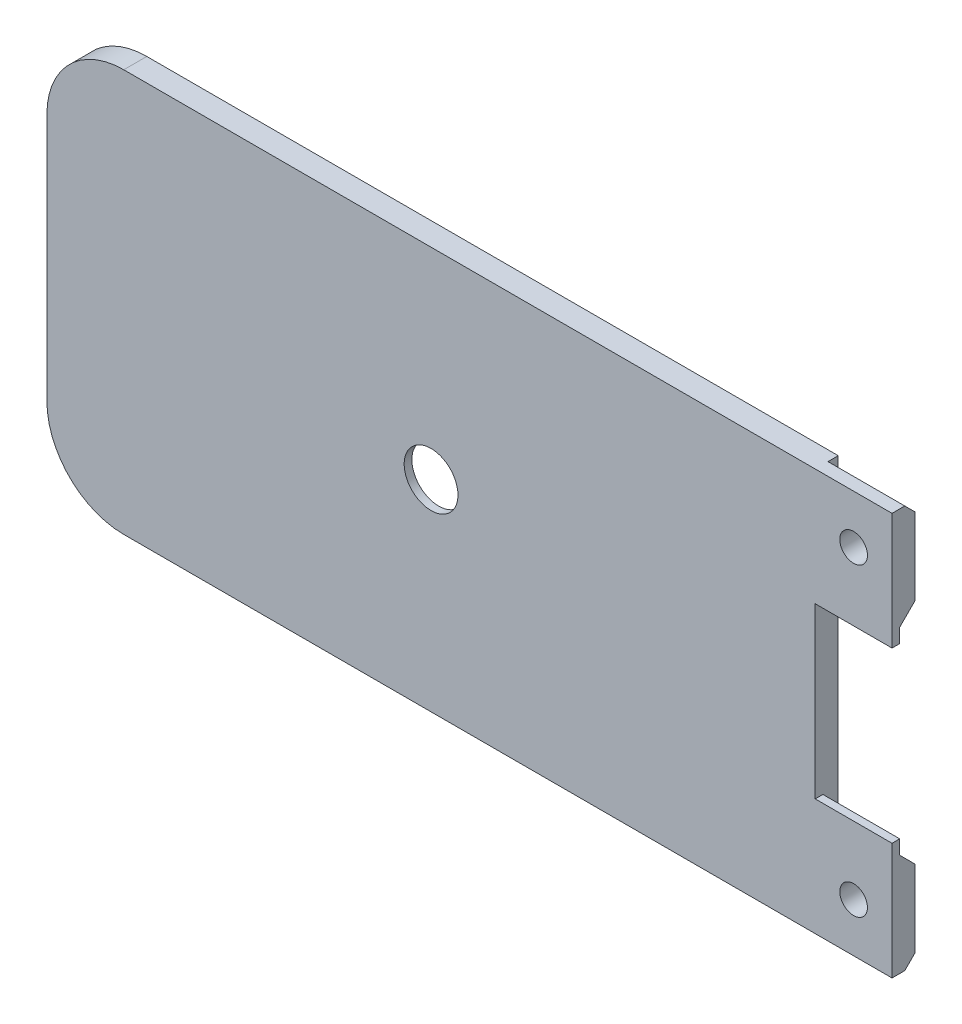
ISO-10303-21;
HEADER;
FILE_DESCRIPTION(('STEP AP214'),'2;1');
FILE_NAME('part.step','',(''),(''),'','','');
FILE_SCHEMA(('AUTOMOTIVE_DESIGN { 1 0 10303 214 1 1 1 1 }'));
ENDSEC;
DATA;
#1=APPLICATION_CONTEXT('core data for automotive mechanical design processes');
#2=APPLICATION_PROTOCOL_DEFINITION('international standard','automotive_design',2000,#1);
#3=PRODUCT_CONTEXT('',#1,'mechanical');
#4=PRODUCT('Part','Part','',(#3));
#5=PRODUCT_RELATED_PRODUCT_CATEGORY('part','',(#4));
#6=PRODUCT_DEFINITION_FORMATION('','',#4);
#7=PRODUCT_DEFINITION_CONTEXT('part definition',#1,'design');
#8=PRODUCT_DEFINITION('design','',#6,#7);
#9=PRODUCT_DEFINITION_SHAPE('','',#8);
#10=(LENGTH_UNIT() NAMED_UNIT(*) SI_UNIT(.MILLI.,.METRE.));
#11=(NAMED_UNIT(*) PLANE_ANGLE_UNIT() SI_UNIT($,.RADIAN.));
#12=(NAMED_UNIT(*) SI_UNIT($,.STERADIAN.) SOLID_ANGLE_UNIT());
#13=UNCERTAINTY_MEASURE_WITH_UNIT(LENGTH_MEASURE(1.E-05),#10,'distance_accuracy_value','');
#14=(GEOMETRIC_REPRESENTATION_CONTEXT(3) GLOBAL_UNCERTAINTY_ASSIGNED_CONTEXT((#13)) GLOBAL_UNIT_ASSIGNED_CONTEXT((#10,
#11,#12)) REPRESENTATION_CONTEXT('',''));
#15=CARTESIAN_POINT('',(0.,0.,0.));
#16=DIRECTION('',(0.,0.,1.));
#17=DIRECTION('',(1.,0.,0.));
#18=AXIS2_PLACEMENT_3D('',#15,#16,#17);
#19=CARTESIAN_POINT('',(0.,0.,0.));
#20=DIRECTION('',(0.,0.,1.));
#21=DIRECTION('',(1.,0.,0.));
#22=AXIS2_PLACEMENT_3D('',#19,#20,#21);
#23=CYLINDRICAL_SURFACE('',#22,3.5);
#24=CARTESIAN_POINT('',(0.,0.,3.));
#25=DIRECTION('',(0.,0.,1.));
#26=DIRECTION('',(1.,0.,0.));
#27=AXIS2_PLACEMENT_3D('',#24,#25,#26);
#28=CIRCLE('',#27,3.5);
#29=CARTESIAN_POINT('',(3.5,0.,3.));
#30=VERTEX_POINT('',#29);
#31=EDGE_CURVE('E349',#30,#30,#28,.T.);
#32=ORIENTED_EDGE('',*,*,#31,.T.);
#33=EDGE_LOOP('',(#32));
#34=FACE_BOUND('',#33,.T.);
#35=CARTESIAN_POINT('',(0.,0.,2.));
#36=DIRECTION('',(0.,0.,-1.));
#37=DIRECTION('',(-1.,0.,0.));
#38=AXIS2_PLACEMENT_3D('',#35,#36,#37);
#39=CIRCLE('',#38,3.5);
#40=CARTESIAN_POINT('',(-3.5,0.,2.));
#41=VERTEX_POINT('',#40);
#42=EDGE_CURVE('E347',#41,#41,#39,.F.);
#43=ORIENTED_EDGE('',*,*,#42,.F.);
#44=EDGE_LOOP('',(#43));
#45=FACE_BOUND('',#44,.T.);
#46=ADVANCED_FACE('F87',(#34,#45),#23,.F.);
#47=CARTESIAN_POINT('',(50.,26.19,3.));
#48=DIRECTION('',(0.,-1.,0.));
#49=DIRECTION('',(1.,0.,0.));
#50=AXIS2_PLACEMENT_3D('',#47,#48,#49);
#51=PLANE('',#50);
#52=DIRECTION('',(-1.,0.,0.));
#53=VECTOR('',#52,1.);
#54=CARTESIAN_POINT('',(50.,26.19,0.));
#55=LINE('',#54,#53);
#56=CARTESIAN_POINT('',(50.,26.19,0.));
#57=VERTEX_POINT('',#56);
#58=CARTESIAN_POINT('',(-40.,26.19,0.));
#59=VERTEX_POINT('',#58);
#60=EDGE_CURVE('E308',#57,#59,#55,.T.);
#61=ORIENTED_EDGE('',*,*,#60,.T.);
#62=DIRECTION('',(0.,0.,-1.));
#63=VECTOR('',#62,1.);
#64=CARTESIAN_POINT('',(-40.,26.19,3.));
#65=LINE('',#64,#63);
#66=CARTESIAN_POINT('',(-40.,26.19,3.));
#67=VERTEX_POINT('',#66);
#68=EDGE_CURVE('E12',#59,#67,#65,.F.);
#69=ORIENTED_EDGE('',*,*,#68,.T.);
#70=DIRECTION('',(-1.,0.,0.));
#71=VECTOR('',#70,1.);
#72=CARTESIAN_POINT('',(50.,26.19,3.));
#73=LINE('',#72,#71);
#74=CARTESIAN_POINT('',(60.0000000000001,26.19,3.));
#75=VERTEX_POINT('',#74);
#76=EDGE_CURVE('E294',#75,#67,#73,.T.);
#77=ORIENTED_EDGE('',*,*,#76,.F.);
#78=DIRECTION('',(0.,0.,-1.));
#79=VECTOR('',#78,1.);
#80=CARTESIAN_POINT('',(60.0000000000001,26.19,3.));
#81=LINE('',#80,#79);
#82=CARTESIAN_POINT('',(60.0000000000001,26.19,1.34000000000001));
#83=VERTEX_POINT('',#82);
#84=EDGE_CURVE('E321',#75,#83,#81,.T.);
#85=ORIENTED_EDGE('',*,*,#84,.T.);
#86=DIRECTION('',(1.,0.,0.));
#87=VECTOR('',#86,1.);
#88=CARTESIAN_POINT('',(45.661509479093,26.19,1.34000000000001));
#89=LINE('',#88,#87);
#90=CARTESIAN_POINT('',(50.,26.19,1.34000000000001));
#91=VERTEX_POINT('',#90);
#92=EDGE_CURVE('E267',#91,#83,#89,.T.);
#93=ORIENTED_EDGE('',*,*,#92,.F.);
#94=DIRECTION('',(0.,0.,1.));
#95=VECTOR('',#94,1.);
#96=CARTESIAN_POINT('',(50.,26.19,1.34000000000001));
#97=LINE('',#96,#95);
#98=EDGE_CURVE('E271',#57,#91,#97,.T.);
#99=ORIENTED_EDGE('',*,*,#98,.F.);
#100=EDGE_LOOP('',(#61,#69,#77,#85,#93,#99));
#101=FACE_BOUND('',#100,.T.);
#102=ADVANCED_FACE('F379',(#101),#51,.F.);
#103=CARTESIAN_POINT('',(0.,0.,0.));
#104=DIRECTION('',(0.,0.,-1.));
#105=DIRECTION('',(-1.,0.,0.));
#106=AXIS2_PLACEMENT_3D('',#103,#104,#105);
#107=PLANE('',#106);
#108=CARTESIAN_POINT('',(0.,0.,0.));
#109=DIRECTION('',(0.,0.,-1.));
#110=DIRECTION('',(-1.,0.,0.));
#111=AXIS2_PLACEMENT_3D('',#108,#109,#110);
#112=CIRCLE('',#111,6.5);
#113=CARTESIAN_POINT('',(-6.5,0.,0.));
#114=VERTEX_POINT('',#113);
#115=EDGE_CURVE('E650',#114,#114,#112,.T.);
#116=ORIENTED_EDGE('',*,*,#115,.F.);
#117=EDGE_LOOP('',(#116));
#118=FACE_BOUND('',#117,.T.);
#119=CARTESIAN_POINT('',(55.,19.85,0.));
#120=DIRECTION('',(0.,0.,-1.));
#121=DIRECTION('',(-1.,0.,0.));
#122=AXIS2_PLACEMENT_3D('',#119,#120,#121);
#123=CIRCLE('',#122,1.8);
#124=CARTESIAN_POINT('',(53.2,19.85,0.));
#125=VERTEX_POINT('',#124);
#126=EDGE_CURVE('E651',#125,#125,#123,.T.);
#127=ORIENTED_EDGE('',*,*,#126,.F.);
#128=EDGE_LOOP('',(#127));
#129=FACE_BOUND('',#128,.T.);
#130=CARTESIAN_POINT('',(55.,-19.85,0.));
#131=DIRECTION('',(0.,0.,-1.));
#132=DIRECTION('',(1.,0.,0.));
#133=AXIS2_PLACEMENT_3D('',#130,#131,#132);
#134=CIRCLE('',#133,1.8);
#135=CARTESIAN_POINT('',(56.8000000000001,-19.85,0.));
#136=VERTEX_POINT('',#135);
#137=EDGE_CURVE('E652',#136,#136,#134,.T.);
#138=ORIENTED_EDGE('',*,*,#137,.F.);
#139=EDGE_LOOP('',(#138));
#140=FACE_BOUND('',#139,.T.);
#141=DIRECTION('',(-1.,0.,0.));
#142=VECTOR('',#141,1.);
#143=CARTESIAN_POINT('',(50.,-26.19,0.));
#144=LINE('',#143,#142);
#145=CARTESIAN_POINT('',(50.,-26.19,0.));
#146=VERTEX_POINT('',#145);
#147=CARTESIAN_POINT('',(-40.,-26.19,0.));
#148=VERTEX_POINT('',#147);
#149=EDGE_CURVE('E315',#146,#148,#144,.T.);
#150=ORIENTED_EDGE('',*,*,#149,.T.);
#151=CARTESIAN_POINT('',(-40.,-16.19,0.));
#152=DIRECTION('',(0.,0.,-1.));
#153=DIRECTION('',(-1.,0.,0.));
#154=AXIS2_PLACEMENT_3D('',#151,#152,#153);
#155=CIRCLE('',#154,10.);
#156=CARTESIAN_POINT('',(-50.,-16.19,0.));
#157=VERTEX_POINT('',#156);
#158=EDGE_CURVE('E354',#148,#157,#155,.T.);
#159=ORIENTED_EDGE('',*,*,#158,.T.);
#160=DIRECTION('',(0.,1.,0.));
#161=VECTOR('',#160,1.);
#162=CARTESIAN_POINT('',(-50.,-26.19,0.));
#163=LINE('',#162,#161);
#164=CARTESIAN_POINT('',(-50.,16.19,0.));
#165=VERTEX_POINT('',#164);
#166=EDGE_CURVE('E306',#157,#165,#163,.T.);
#167=ORIENTED_EDGE('',*,*,#166,.T.);
#168=CARTESIAN_POINT('',(-40.,16.19,0.));
#169=DIRECTION('',(0.,0.,-1.));
#170=DIRECTION('',(-1.,0.,0.));
#171=AXIS2_PLACEMENT_3D('',#168,#169,#170);
#172=CIRCLE('',#171,10.);
#173=EDGE_CURVE('E352',#165,#59,#172,.T.);
#174=ORIENTED_EDGE('',*,*,#173,.T.);
#175=ORIENTED_EDGE('',*,*,#60,.F.);
#176=DIRECTION('',(0.,1.,0.));
#177=VECTOR('',#176,1.);
#178=CARTESIAN_POINT('',(50.,26.19,0.));
#179=LINE('',#178,#177);
#180=CARTESIAN_POINT('',(50.,24.85,0.));
#181=VERTEX_POINT('',#180);
#182=EDGE_CURVE('E273',#181,#57,#179,.T.);
#183=ORIENTED_EDGE('',*,*,#182,.F.);
#184=DIRECTION('',(1.,0.,0.));
#185=VECTOR('',#184,1.);
#186=CARTESIAN_POINT('',(45.661509479093,24.85,0.));
#187=LINE('',#186,#185);
#188=CARTESIAN_POINT('',(60.0000000000001,24.85,0.));
#189=VERTEX_POINT('',#188);
#190=EDGE_CURVE('E262',#181,#189,#187,.T.);
#191=ORIENTED_EDGE('',*,*,#190,.T.);
#192=DIRECTION('',(0.,-1.,0.));
#193=VECTOR('',#192,1.);
#194=CARTESIAN_POINT('',(60.0000000000001,26.19,0.));
#195=LINE('',#194,#193);
#196=CARTESIAN_POINT('',(60.0000000000001,14.85,0.));
#197=VERTEX_POINT('',#196);
#198=EDGE_CURVE('E318',#189,#197,#195,.T.);
#199=ORIENTED_EDGE('',*,*,#198,.T.);
#200=DIRECTION('',(1.,0.,0.));
#201=VECTOR('',#200,1.);
#202=CARTESIAN_POINT('',(45.661509479093,14.85,0.));
#203=LINE('',#202,#201);
#204=CARTESIAN_POINT('',(50.,14.85,0.));
#205=VERTEX_POINT('',#204);
#206=EDGE_CURVE('E260',#205,#197,#203,.T.);
#207=ORIENTED_EDGE('',*,*,#206,.F.);
#208=DIRECTION('',(0.,1.,0.));
#209=VECTOR('',#208,1.);
#210=CARTESIAN_POINT('',(50.,-26.19,0.));
#211=LINE('',#210,#209);
#212=CARTESIAN_POINT('',(50.,-14.85,0.));
#213=VERTEX_POINT('',#212);
#214=EDGE_CURVE('E300',#213,#205,#211,.T.);
#215=ORIENTED_EDGE('',*,*,#214,.F.);
#216=DIRECTION('',(1.,0.,0.));
#217=VECTOR('',#216,1.);
#218=CARTESIAN_POINT('',(45.661509479093,-14.85,0.));
#219=LINE('',#218,#217);
#220=CARTESIAN_POINT('',(60.0000000000001,-14.85,0.));
#221=VERTEX_POINT('',#220);
#222=EDGE_CURVE('E286',#213,#221,#219,.T.);
#223=ORIENTED_EDGE('',*,*,#222,.T.);
#224=DIRECTION('',(0.,1.,0.));
#225=VECTOR('',#224,1.);
#226=CARTESIAN_POINT('',(60.0000000000001,-26.19,0.));
#227=LINE('',#226,#225);
#228=CARTESIAN_POINT('',(60.0000000000001,-24.85,0.));
#229=VERTEX_POINT('',#228);
#230=EDGE_CURVE('E233',#229,#221,#227,.T.);
#231=ORIENTED_EDGE('',*,*,#230,.F.);
#232=DIRECTION('',(1.,0.,0.));
#233=VECTOR('',#232,1.);
#234=CARTESIAN_POINT('',(45.661509479093,-24.85,0.));
#235=LINE('',#234,#233);
#236=CARTESIAN_POINT('',(50.,-24.85,0.));
#237=VERTEX_POINT('',#236);
#238=EDGE_CURVE('E214',#237,#229,#235,.T.);
#239=ORIENTED_EDGE('',*,*,#238,.F.);
#240=DIRECTION('',(0.,1.,0.));
#241=VECTOR('',#240,1.);
#242=CARTESIAN_POINT('',(50.,-26.19,0.));
#243=LINE('',#242,#241);
#244=EDGE_CURVE('E221',#146,#237,#243,.T.);
#245=ORIENTED_EDGE('',*,*,#244,.F.);
#246=EDGE_LOOP('',(#150,#159,#167,#174,#175,#183,#191,#199,#207,#215,#223,#231,#239,#245));
#247=FACE_BOUND('',#246,.T.);
#248=ADVANCED_FACE('F235',(#118,#129,#140,#247),#107,.T.);
#249=CARTESIAN_POINT('',(50.,-26.19,3.));
#250=DIRECTION('',(0.,-1.,0.));
#251=DIRECTION('',(1.,0.,0.));
#252=AXIS2_PLACEMENT_3D('',#249,#250,#251);
#253=PLANE('',#252);
#254=DIRECTION('',(-1.,0.,0.));
#255=VECTOR('',#254,1.);
#256=CARTESIAN_POINT('',(50.,-26.19,3.));
#257=LINE('',#256,#255);
#258=CARTESIAN_POINT('',(60.0000000000001,-26.19,3.));
#259=VERTEX_POINT('',#258);
#260=CARTESIAN_POINT('',(-40.,-26.19,3.));
#261=VERTEX_POINT('',#260);
#262=EDGE_CURVE('E298',#259,#261,#257,.T.);
#263=ORIENTED_EDGE('',*,*,#262,.T.);
#264=DIRECTION('',(0.,0.,-1.));
#265=VECTOR('',#264,1.);
#266=CARTESIAN_POINT('',(-40.,-26.19,3.));
#267=LINE('',#266,#265);
#268=EDGE_CURVE('E327',#261,#148,#267,.T.);
#269=ORIENTED_EDGE('',*,*,#268,.T.);
#270=ORIENTED_EDGE('',*,*,#149,.F.);
#271=DIRECTION('',(0.,0.,-1.));
#272=VECTOR('',#271,1.);
#273=CARTESIAN_POINT('',(50.,-26.19,1.34000000000001));
#274=LINE('',#273,#272);
#275=CARTESIAN_POINT('',(50.,-26.19,1.34000000000001));
#276=VERTEX_POINT('',#275);
#277=EDGE_CURVE('E226',#276,#146,#274,.T.);
#278=ORIENTED_EDGE('',*,*,#277,.F.);
#279=DIRECTION('',(1.,0.,0.));
#280=VECTOR('',#279,1.);
#281=CARTESIAN_POINT('',(45.661509479093,-26.19,1.34000000000001));
#282=LINE('',#281,#280);
#283=CARTESIAN_POINT('',(60.0000000000001,-26.19,1.34000000000001));
#284=VERTEX_POINT('',#283);
#285=EDGE_CURVE('E217',#276,#284,#282,.T.);
#286=ORIENTED_EDGE('',*,*,#285,.T.);
#287=DIRECTION('',(0.,0.,-1.));
#288=VECTOR('',#287,1.);
#289=CARTESIAN_POINT('',(60.0000000000001,-26.19,3.));
#290=LINE('',#289,#288);
#291=EDGE_CURVE('E322',#259,#284,#290,.T.);
#292=ORIENTED_EDGE('',*,*,#291,.F.);
#293=EDGE_LOOP('',(#263,#269,#270,#278,#286,#292));
#294=FACE_BOUND('',#293,.T.);
#295=ADVANCED_FACE('F367',(#294),#253,.T.);
#296=CARTESIAN_POINT('',(60.0000000000001,-26.19,3.));
#297=DIRECTION('',(-1.,0.,0.));
#298=DIRECTION('',(0.,0.,1.));
#299=AXIS2_PLACEMENT_3D('',#296,#297,#298);
#300=PLANE('',#299);
#301=DIRECTION('',(0.,-0.707106781186548,0.707106781186547));
#302=VECTOR('',#301,1.);
#303=CARTESIAN_POINT('',(60.0000000000001,-24.85,0.));
#304=LINE('',#303,#302);
#305=EDGE_CURVE('E222',#229,#284,#304,.T.);
#306=ORIENTED_EDGE('',*,*,#305,.F.);
#307=ORIENTED_EDGE('',*,*,#230,.T.);
#308=DIRECTION('',(0.,-0.707106781186547,-0.707106781186548));
#309=VECTOR('',#308,1.);
#310=CARTESIAN_POINT('',(60.0000000000001,-12.85,2.));
#311=LINE('',#310,#309);
#312=CARTESIAN_POINT('',(60.0000000000001,-12.85,2.));
#313=VERTEX_POINT('',#312);
#314=EDGE_CURVE('E279',#313,#221,#311,.T.);
#315=ORIENTED_EDGE('',*,*,#314,.F.);
#316=DIRECTION('',(0.,-1.,0.));
#317=VECTOR('',#316,1.);
#318=CARTESIAN_POINT('',(60.0000000000001,-11.,2.));
#319=LINE('',#318,#317);
#320=CARTESIAN_POINT('',(60.0000000000001,-11.,2.));
#321=VERTEX_POINT('',#320);
#322=EDGE_CURVE('E249',#321,#313,#319,.T.);
#323=ORIENTED_EDGE('',*,*,#322,.F.);
#324=DIRECTION('',(0.,0.,-1.));
#325=VECTOR('',#324,1.);
#326=CARTESIAN_POINT('',(60.0000000000001,-11.,3.));
#327=LINE('',#326,#325);
#328=CARTESIAN_POINT('',(60.0000000000001,-11.,3.));
#329=VERTEX_POINT('',#328);
#330=EDGE_CURVE('E337',#329,#321,#327,.T.);
#331=ORIENTED_EDGE('',*,*,#330,.F.);
#332=DIRECTION('',(0.,1.,0.));
#333=VECTOR('',#332,1.);
#334=CARTESIAN_POINT('',(60.0000000000001,-26.19,3.));
#335=LINE('',#334,#333);
#336=EDGE_CURVE('E334',#259,#329,#335,.T.);
#337=ORIENTED_EDGE('',*,*,#336,.F.);
#338=ORIENTED_EDGE('',*,*,#291,.T.);
#339=EDGE_LOOP('',(#306,#307,#315,#323,#331,#337,#338));
#340=FACE_BOUND('',#339,.T.);
#341=ADVANCED_FACE('F413',(#340),#300,.F.);
#342=CARTESIAN_POINT('',(-50.,-26.19,3.));
#343=DIRECTION('',(-1.,0.,0.));
#344=DIRECTION('',(0.,0.,1.));
#345=AXIS2_PLACEMENT_3D('',#342,#343,#344);
#346=PLANE('',#345);
#347=ORIENTED_EDGE('',*,*,#166,.F.);
#348=DIRECTION('',(0.,0.,-1.));
#349=VECTOR('',#348,1.);
#350=CARTESIAN_POINT('',(-50.,-16.19,3.));
#351=LINE('',#350,#349);
#352=CARTESIAN_POINT('',(-50.,-16.19,3.));
#353=VERTEX_POINT('',#352);
#354=EDGE_CURVE('E358',#157,#353,#351,.F.);
#355=ORIENTED_EDGE('',*,*,#354,.T.);
#356=DIRECTION('',(0.,1.,0.));
#357=VECTOR('',#356,1.);
#358=CARTESIAN_POINT('',(-50.,-26.19,3.));
#359=LINE('',#358,#357);
#360=CARTESIAN_POINT('',(-50.,16.19,3.));
#361=VERTEX_POINT('',#360);
#362=EDGE_CURVE('E296',#353,#361,#359,.T.);
#363=ORIENTED_EDGE('',*,*,#362,.T.);
#364=DIRECTION('',(0.,0.,-1.));
#365=VECTOR('',#364,1.);
#366=CARTESIAN_POINT('',(-50.,16.19,0.));
#367=LINE('',#366,#365);
#368=EDGE_CURVE('E360',#361,#165,#367,.T.);
#369=ORIENTED_EDGE('',*,*,#368,.T.);
#370=EDGE_LOOP('',(#347,#355,#363,#369));
#371=FACE_BOUND('',#370,.T.);
#372=ADVANCED_FACE('F372',(#371),#346,.T.);
#373=CARTESIAN_POINT('',(0.,0.,3.));
#374=DIRECTION('',(0.,0.,-1.));
#375=DIRECTION('',(-1.,0.,0.));
#376=AXIS2_PLACEMENT_3D('',#373,#374,#375);
#377=PLANE('',#376);
#378=ORIENTED_EDGE('',*,*,#31,.F.);
#379=EDGE_LOOP('',(#378));
#380=FACE_BOUND('',#379,.T.);
#381=CARTESIAN_POINT('',(55.,19.85,3.));
#382=DIRECTION('',(0.,0.,-1.));
#383=DIRECTION('',(-1.,0.,0.));
#384=AXIS2_PLACEMENT_3D('',#381,#382,#383);
#385=CIRCLE('',#384,1.8);
#386=CARTESIAN_POINT('',(53.2,19.85,3.));
#387=VERTEX_POINT('',#386);
#388=EDGE_CURVE('E268',#387,#387,#385,.T.);
#389=ORIENTED_EDGE('',*,*,#388,.T.);
#390=EDGE_LOOP('',(#389));
#391=FACE_BOUND('',#390,.T.);
#392=CARTESIAN_POINT('',(55.,-19.85,3.));
#393=DIRECTION('',(0.,0.,-1.));
#394=DIRECTION('',(1.,0.,0.));
#395=AXIS2_PLACEMENT_3D('',#392,#393,#394);
#396=CIRCLE('',#395,1.8);
#397=CARTESIAN_POINT('',(56.8000000000001,-19.85,3.));
#398=VERTEX_POINT('',#397);
#399=EDGE_CURVE('E242',#398,#398,#396,.T.);
#400=ORIENTED_EDGE('',*,*,#399,.T.);
#401=EDGE_LOOP('',(#400));
#402=FACE_BOUND('',#401,.T.);
#403=ORIENTED_EDGE('',*,*,#362,.F.);
#404=CARTESIAN_POINT('',(-40.,-16.19,3.));
#405=DIRECTION('',(0.,0.,-1.));
#406=DIRECTION('',(-1.,0.,0.));
#407=AXIS2_PLACEMENT_3D('',#404,#405,#406);
#408=CIRCLE('',#407,10.);
#409=EDGE_CURVE('E92',#353,#261,#408,.F.);
#410=ORIENTED_EDGE('',*,*,#409,.T.);
#411=ORIENTED_EDGE('',*,*,#262,.F.);
#412=ORIENTED_EDGE('',*,*,#336,.T.);
#413=DIRECTION('',(1.,0.,0.));
#414=VECTOR('',#413,1.);
#415=CARTESIAN_POINT('',(50.,-11.,3.));
#416=LINE('',#415,#414);
#417=CARTESIAN_POINT('',(50.,-11.,3.));
#418=VERTEX_POINT('',#417);
#419=EDGE_CURVE('E333',#418,#329,#416,.T.);
#420=ORIENTED_EDGE('',*,*,#419,.F.);
#421=DIRECTION('',(0.,1.,0.));
#422=VECTOR('',#421,1.);
#423=CARTESIAN_POINT('',(50.,-26.19,3.));
#424=LINE('',#423,#422);
#425=CARTESIAN_POINT('',(50.,11.,3.));
#426=VERTEX_POINT('',#425);
#427=EDGE_CURVE('E305',#418,#426,#424,.T.);
#428=ORIENTED_EDGE('',*,*,#427,.T.);
#429=DIRECTION('',(1.,0.,0.));
#430=VECTOR('',#429,1.);
#431=CARTESIAN_POINT('',(50.,11.,3.));
#432=LINE('',#431,#430);
#433=CARTESIAN_POINT('',(60.0000000000001,11.,3.));
#434=VERTEX_POINT('',#433);
#435=EDGE_CURVE('E312',#426,#434,#432,.T.);
#436=ORIENTED_EDGE('',*,*,#435,.T.);
#437=DIRECTION('',(0.,-1.,0.));
#438=VECTOR('',#437,1.);
#439=CARTESIAN_POINT('',(60.0000000000001,26.19,3.));
#440=LINE('',#439,#438);
#441=EDGE_CURVE('E320',#75,#434,#440,.T.);
#442=ORIENTED_EDGE('',*,*,#441,.F.);
#443=ORIENTED_EDGE('',*,*,#76,.T.);
#444=CARTESIAN_POINT('',(-40.,16.19,3.));
#445=DIRECTION('',(0.,0.,-1.));
#446=DIRECTION('',(-1.,0.,0.));
#447=AXIS2_PLACEMENT_3D('',#444,#445,#446);
#448=CIRCLE('',#447,10.);
#449=EDGE_CURVE('E110',#67,#361,#448,.F.);
#450=ORIENTED_EDGE('',*,*,#449,.T.);
#451=EDGE_LOOP('',(#403,#410,#411,#412,#420,#428,#436,#442,#443,#450));
#452=FACE_BOUND('',#451,.T.);
#453=ADVANCED_FACE('F361',(#380,#391,#402,#452),#377,.F.);
#454=CARTESIAN_POINT('',(50.,-26.19,3.));
#455=DIRECTION('',(-1.,0.,0.));
#456=DIRECTION('',(0.,0.,1.));
#457=AXIS2_PLACEMENT_3D('',#454,#455,#456);
#458=PLANE('',#457);
#459=DIRECTION('',(0.,0.,-1.));
#460=VECTOR('',#459,1.);
#461=CARTESIAN_POINT('',(50.,11.,3.));
#462=LINE('',#461,#460);
#463=CARTESIAN_POINT('',(50.,11.,2.));
#464=VERTEX_POINT('',#463);
#465=EDGE_CURVE('E324',#426,#464,#462,.T.);
#466=ORIENTED_EDGE('',*,*,#465,.F.);
#467=ORIENTED_EDGE('',*,*,#427,.F.);
#468=DIRECTION('',(0.,0.,-1.));
#469=VECTOR('',#468,1.);
#470=CARTESIAN_POINT('',(50.,-11.,3.));
#471=LINE('',#470,#469);
#472=CARTESIAN_POINT('',(50.,-11.,2.));
#473=VERTEX_POINT('',#472);
#474=EDGE_CURVE('E303',#418,#473,#471,.T.);
#475=ORIENTED_EDGE('',*,*,#474,.T.);
#476=DIRECTION('',(0.,-1.,0.));
#477=VECTOR('',#476,1.);
#478=CARTESIAN_POINT('',(50.,-11.,2.));
#479=LINE('',#478,#477);
#480=CARTESIAN_POINT('',(50.,-12.85,2.));
#481=VERTEX_POINT('',#480);
#482=EDGE_CURVE('E278',#473,#481,#479,.T.);
#483=ORIENTED_EDGE('',*,*,#482,.T.);
#484=DIRECTION('',(0.,-0.707106781186547,-0.707106781186548));
#485=VECTOR('',#484,1.);
#486=CARTESIAN_POINT('',(50.,-12.85,2.));
#487=LINE('',#486,#485);
#488=EDGE_CURVE('E287',#481,#213,#487,.T.);
#489=ORIENTED_EDGE('',*,*,#488,.T.);
#490=ORIENTED_EDGE('',*,*,#214,.T.);
#491=DIRECTION('',(0.,-0.707106781186547,0.707106781186548));
#492=VECTOR('',#491,1.);
#493=CARTESIAN_POINT('',(50.,12.85,2.));
#494=LINE('',#493,#492);
#495=CARTESIAN_POINT('',(50.,12.85,2.));
#496=VERTEX_POINT('',#495);
#497=EDGE_CURVE('E253',#205,#496,#494,.T.);
#498=ORIENTED_EDGE('',*,*,#497,.T.);
#499=DIRECTION('',(0.,-1.,0.));
#500=VECTOR('',#499,1.);
#501=CARTESIAN_POINT('',(50.,11.,2.));
#502=LINE('',#501,#500);
#503=EDGE_CURVE('E258',#496,#464,#502,.T.);
#504=ORIENTED_EDGE('',*,*,#503,.T.);
#505=EDGE_LOOP('',(#466,#467,#475,#483,#489,#490,#498,#504));
#506=FACE_BOUND('',#505,.T.);
#507=ADVANCED_FACE('F404',(#506),#458,.F.);
#508=CARTESIAN_POINT('',(50.,-11.,3.));
#509=DIRECTION('',(0.,1.,0.));
#510=DIRECTION('',(0.,0.,1.));
#511=AXIS2_PLACEMENT_3D('',#508,#509,#510);
#512=PLANE('',#511);
#513=DIRECTION('',(1.,0.,0.));
#514=VECTOR('',#513,1.);
#515=CARTESIAN_POINT('',(45.661509479093,-11.,2.));
#516=LINE('',#515,#514);
#517=EDGE_CURVE('E292',#473,#321,#516,.T.);
#518=ORIENTED_EDGE('',*,*,#517,.F.);
#519=ORIENTED_EDGE('',*,*,#474,.F.);
#520=ORIENTED_EDGE('',*,*,#419,.T.);
#521=ORIENTED_EDGE('',*,*,#330,.T.);
#522=EDGE_LOOP('',(#518,#519,#520,#521));
#523=FACE_BOUND('',#522,.T.);
#524=ADVANCED_FACE('F412',(#523),#512,.T.);
#525=CARTESIAN_POINT('',(60.0000000000001,26.19,3.));
#526=DIRECTION('',(1.,0.,0.));
#527=DIRECTION('',(0.,0.,-1.));
#528=AXIS2_PLACEMENT_3D('',#525,#526,#527);
#529=PLANE('',#528);
#530=DIRECTION('',(0.,-0.707106781186548,-0.707106781186547));
#531=VECTOR('',#530,1.);
#532=CARTESIAN_POINT('',(60.0000000000001,24.85,0.));
#533=LINE('',#532,#531);
#534=EDGE_CURVE('E252',#83,#189,#533,.T.);
#535=ORIENTED_EDGE('',*,*,#534,.F.);
#536=ORIENTED_EDGE('',*,*,#84,.F.);
#537=ORIENTED_EDGE('',*,*,#441,.T.);
#538=DIRECTION('',(0.,0.,-1.));
#539=VECTOR('',#538,1.);
#540=CARTESIAN_POINT('',(60.0000000000001,11.,3.));
#541=LINE('',#540,#539);
#542=CARTESIAN_POINT('',(60.0000000000001,11.,2.));
#543=VERTEX_POINT('',#542);
#544=EDGE_CURVE('E310',#434,#543,#541,.T.);
#545=ORIENTED_EDGE('',*,*,#544,.T.);
#546=DIRECTION('',(0.,-1.,0.));
#547=VECTOR('',#546,1.);
#548=CARTESIAN_POINT('',(60.0000000000001,11.,2.));
#549=LINE('',#548,#547);
#550=CARTESIAN_POINT('',(60.0000000000001,12.85,2.));
#551=VERTEX_POINT('',#550);
#552=EDGE_CURVE('E239',#551,#543,#549,.T.);
#553=ORIENTED_EDGE('',*,*,#552,.F.);
#554=DIRECTION('',(0.,-0.707106781186547,0.707106781186548));
#555=VECTOR('',#554,1.);
#556=CARTESIAN_POINT('',(60.0000000000001,12.85,2.));
#557=LINE('',#556,#555);
#558=EDGE_CURVE('E237',#197,#551,#557,.T.);
#559=ORIENTED_EDGE('',*,*,#558,.F.);
#560=ORIENTED_EDGE('',*,*,#198,.F.);
#561=EDGE_LOOP('',(#535,#536,#537,#545,#553,#559,#560));
#562=FACE_BOUND('',#561,.T.);
#563=ADVANCED_FACE('F391',(#562),#529,.T.);
#564=CARTESIAN_POINT('',(50.,11.,3.));
#565=DIRECTION('',(0.,1.,0.));
#566=DIRECTION('',(0.,0.,1.));
#567=AXIS2_PLACEMENT_3D('',#564,#565,#566);
#568=PLANE('',#567);
#569=ORIENTED_EDGE('',*,*,#465,.T.);
#570=DIRECTION('',(1.,0.,0.));
#571=VECTOR('',#570,1.);
#572=CARTESIAN_POINT('',(45.661509479093,11.,2.));
#573=LINE('',#572,#571);
#574=EDGE_CURVE('E251',#464,#543,#573,.T.);
#575=ORIENTED_EDGE('',*,*,#574,.T.);
#576=ORIENTED_EDGE('',*,*,#544,.F.);
#577=ORIENTED_EDGE('',*,*,#435,.F.);
#578=EDGE_LOOP('',(#569,#575,#576,#577));
#579=FACE_BOUND('',#578,.T.);
#580=ADVANCED_FACE('F420',(#579),#568,.F.);
#581=CARTESIAN_POINT('',(45.661509479093,11.,2.));
#582=DIRECTION('',(0.,0.,1.));
#583=DIRECTION('',(0.,-1.,0.));
#584=AXIS2_PLACEMENT_3D('',#581,#582,#583);
#585=PLANE('',#584);
#586=DIRECTION('',(1.,0.,0.));
#587=VECTOR('',#586,1.);
#588=CARTESIAN_POINT('',(45.661509479093,12.85,2.));
#589=LINE('',#588,#587);
#590=EDGE_CURVE('E246',#496,#551,#589,.T.);
#591=ORIENTED_EDGE('',*,*,#590,.T.);
#592=ORIENTED_EDGE('',*,*,#552,.T.);
#593=ORIENTED_EDGE('',*,*,#574,.F.);
#594=ORIENTED_EDGE('',*,*,#503,.F.);
#595=EDGE_LOOP('',(#591,#592,#593,#594));
#596=FACE_BOUND('',#595,.T.);
#597=ADVANCED_FACE('F425',(#596),#585,.F.);
#598=CARTESIAN_POINT('',(45.661509479093,12.85,2.));
#599=DIRECTION('',(0.,0.707106781186548,0.707106781186547));
#600=DIRECTION('',(0.,-0.707106781186547,0.707106781186548));
#601=AXIS2_PLACEMENT_3D('',#598,#599,#600);
#602=PLANE('',#601);
#603=ORIENTED_EDGE('',*,*,#206,.T.);
#604=ORIENTED_EDGE('',*,*,#558,.T.);
#605=ORIENTED_EDGE('',*,*,#590,.F.);
#606=ORIENTED_EDGE('',*,*,#497,.F.);
#607=EDGE_LOOP('',(#603,#604,#605,#606));
#608=FACE_BOUND('',#607,.T.);
#609=ADVANCED_FACE('F397',(#608),#602,.F.);
#610=CARTESIAN_POINT('',(50.,-26.19,3.));
#611=DIRECTION('',(-1.,0.,0.));
#612=DIRECTION('',(0.,0.,1.));
#613=AXIS2_PLACEMENT_3D('',#610,#611,#612);
#614=PLANE('',#613);
#615=DIRECTION('',(0.,-0.707106781186548,-0.707106781186547));
#616=VECTOR('',#615,1.);
#617=CARTESIAN_POINT('',(50.,24.85,0.));
#618=LINE('',#617,#616);
#619=EDGE_CURVE('E270',#91,#181,#618,.T.);
#620=ORIENTED_EDGE('',*,*,#619,.T.);
#621=ORIENTED_EDGE('',*,*,#182,.T.);
#622=ORIENTED_EDGE('',*,*,#98,.T.);
#623=EDGE_LOOP('',(#620,#621,#622));
#624=FACE_BOUND('',#623,.T.);
#625=ADVANCED_FACE('F382',(#624),#614,.F.);
#626=CARTESIAN_POINT('',(45.661509479093,24.85,0.));
#627=DIRECTION('',(0.,-0.707106781186547,0.707106781186548));
#628=DIRECTION('',(0.,-0.707106781186548,-0.707106781186547));
#629=AXIS2_PLACEMENT_3D('',#626,#627,#628);
#630=PLANE('',#629);
#631=ORIENTED_EDGE('',*,*,#92,.T.);
#632=ORIENTED_EDGE('',*,*,#534,.T.);
#633=ORIENTED_EDGE('',*,*,#190,.F.);
#634=ORIENTED_EDGE('',*,*,#619,.F.);
#635=EDGE_LOOP('',(#631,#632,#633,#634));
#636=FACE_BOUND('',#635,.T.);
#637=ADVANCED_FACE('F563',(#636),#630,.F.);
#638=CARTESIAN_POINT('',(45.661509479093,-11.,2.));
#639=DIRECTION('',(0.,0.,1.));
#640=DIRECTION('',(0.,-1.,0.));
#641=AXIS2_PLACEMENT_3D('',#638,#639,#640);
#642=PLANE('',#641);
#643=ORIENTED_EDGE('',*,*,#517,.T.);
#644=ORIENTED_EDGE('',*,*,#322,.T.);
#645=DIRECTION('',(1.,0.,0.));
#646=VECTOR('',#645,1.);
#647=CARTESIAN_POINT('',(45.661509479093,-12.85,2.));
#648=LINE('',#647,#646);
#649=EDGE_CURVE('E284',#481,#313,#648,.T.);
#650=ORIENTED_EDGE('',*,*,#649,.F.);
#651=ORIENTED_EDGE('',*,*,#482,.F.);
#652=EDGE_LOOP('',(#643,#644,#650,#651));
#653=FACE_BOUND('',#652,.T.);
#654=ADVANCED_FACE('F407',(#653),#642,.F.);
#655=CARTESIAN_POINT('',(45.661509479093,-12.85,2.));
#656=DIRECTION('',(0.,-0.707106781186548,0.707106781186547));
#657=DIRECTION('',(0.,-0.707106781186547,-0.707106781186548));
#658=AXIS2_PLACEMENT_3D('',#655,#656,#657);
#659=PLANE('',#658);
#660=ORIENTED_EDGE('',*,*,#649,.T.);
#661=ORIENTED_EDGE('',*,*,#314,.T.);
#662=ORIENTED_EDGE('',*,*,#222,.F.);
#663=ORIENTED_EDGE('',*,*,#488,.F.);
#664=EDGE_LOOP('',(#660,#661,#662,#663));
#665=FACE_BOUND('',#664,.T.);
#666=ADVANCED_FACE('F402',(#665),#659,.F.);
#667=CARTESIAN_POINT('',(50.,-26.19,3.));
#668=DIRECTION('',(-1.,0.,0.));
#669=DIRECTION('',(0.,0.,1.));
#670=AXIS2_PLACEMENT_3D('',#667,#668,#669);
#671=PLANE('',#670);
#672=ORIENTED_EDGE('',*,*,#244,.T.);
#673=DIRECTION('',(0.,-0.707106781186548,0.707106781186547));
#674=VECTOR('',#673,1.);
#675=CARTESIAN_POINT('',(50.,-24.85,0.));
#676=LINE('',#675,#674);
#677=EDGE_CURVE('E211',#237,#276,#676,.T.);
#678=ORIENTED_EDGE('',*,*,#677,.T.);
#679=ORIENTED_EDGE('',*,*,#277,.T.);
#680=EDGE_LOOP('',(#672,#678,#679));
#681=FACE_BOUND('',#680,.T.);
#682=ADVANCED_FACE('F223',(#681),#671,.F.);
#683=CARTESIAN_POINT('',(45.661509479093,-24.85,0.));
#684=DIRECTION('',(0.,0.707106781186547,0.707106781186548));
#685=DIRECTION('',(0.,-0.707106781186548,0.707106781186547));
#686=AXIS2_PLACEMENT_3D('',#683,#684,#685);
#687=PLANE('',#686);
#688=ORIENTED_EDGE('',*,*,#238,.T.);
#689=ORIENTED_EDGE('',*,*,#305,.T.);
#690=ORIENTED_EDGE('',*,*,#285,.F.);
#691=ORIENTED_EDGE('',*,*,#677,.F.);
#692=EDGE_LOOP('',(#688,#689,#690,#691));
#693=FACE_BOUND('',#692,.T.);
#694=ADVANCED_FACE('F213',(#693),#687,.F.);
#695=CARTESIAN_POINT('',(55.,-19.85,3.));
#696=DIRECTION('',(0.,0.,-1.));
#697=DIRECTION('',(-1.,0.,0.));
#698=AXIS2_PLACEMENT_3D('',#695,#696,#697);
#699=CYLINDRICAL_SURFACE('',#698,1.8);
#700=ORIENTED_EDGE('',*,*,#399,.F.);
#701=EDGE_LOOP('',(#700));
#702=FACE_BOUND('',#701,.T.);
#703=ORIENTED_EDGE('',*,*,#137,.T.);
#704=EDGE_LOOP('',(#703));
#705=FACE_BOUND('',#704,.T.);
#706=ADVANCED_FACE('F455',(#702,#705),#699,.F.);
#707=CARTESIAN_POINT('',(55.,19.85,3.));
#708=DIRECTION('',(0.,0.,-1.));
#709=DIRECTION('',(-1.,0.,0.));
#710=AXIS2_PLACEMENT_3D('',#707,#708,#709);
#711=CYLINDRICAL_SURFACE('',#710,1.8);
#712=ORIENTED_EDGE('',*,*,#388,.F.);
#713=EDGE_LOOP('',(#712));
#714=FACE_BOUND('',#713,.T.);
#715=ORIENTED_EDGE('',*,*,#126,.T.);
#716=EDGE_LOOP('',(#715));
#717=FACE_BOUND('',#716,.T.);
#718=ADVANCED_FACE('F448',(#714,#717),#711,.F.);
#719=CARTESIAN_POINT('',(0.,0.,2.));
#720=DIRECTION('',(0.,0.,-1.));
#721=DIRECTION('',(-1.,0.,0.));
#722=AXIS2_PLACEMENT_3D('',#719,#720,#721);
#723=PLANE('',#722);
#724=CARTESIAN_POINT('',(0.,0.,2.));
#725=DIRECTION('',(0.,0.,-1.));
#726=DIRECTION('',(-1.,0.,0.));
#727=AXIS2_PLACEMENT_3D('',#724,#725,#726);
#728=CIRCLE('',#727,6.5);
#729=CARTESIAN_POINT('',(-6.5,0.,2.));
#730=VERTEX_POINT('',#729);
#731=EDGE_CURVE('E348',#730,#730,#728,.T.);
#732=ORIENTED_EDGE('',*,*,#731,.T.);
#733=EDGE_LOOP('',(#732));
#734=FACE_BOUND('',#733,.T.);
#735=ORIENTED_EDGE('',*,*,#42,.T.);
#736=EDGE_LOOP('',(#735));
#737=FACE_BOUND('',#736,.T.);
#738=ADVANCED_FACE('F452',(#734,#737),#723,.T.);
#739=CARTESIAN_POINT('',(0.,0.,2.));
#740=DIRECTION('',(0.,0.,-1.));
#741=DIRECTION('',(-1.,0.,0.));
#742=AXIS2_PLACEMENT_3D('',#739,#740,#741);
#743=CYLINDRICAL_SURFACE('',#742,6.5);
#744=ORIENTED_EDGE('',*,*,#731,.F.);
#745=EDGE_LOOP('',(#744));
#746=FACE_BOUND('',#745,.T.);
#747=ORIENTED_EDGE('',*,*,#115,.T.);
#748=EDGE_LOOP('',(#747));
#749=FACE_BOUND('',#748,.T.);
#750=ADVANCED_FACE('F450',(#746,#749),#743,.F.);
#751=CARTESIAN_POINT('',(-40.,-16.19,3.));
#752=DIRECTION('',(0.,0.,-1.));
#753=DIRECTION('',(-1.,0.,0.));
#754=AXIS2_PLACEMENT_3D('',#751,#752,#753);
#755=CYLINDRICAL_SURFACE('',#754,10.);
#756=ORIENTED_EDGE('',*,*,#409,.F.);
#757=ORIENTED_EDGE('',*,*,#354,.F.);
#758=ORIENTED_EDGE('',*,*,#158,.F.);
#759=ORIENTED_EDGE('',*,*,#268,.F.);
#760=EDGE_LOOP('',(#756,#757,#758,#759));
#761=FACE_BOUND('',#760,.T.);
#762=ADVANCED_FACE('F371',(#761),#755,.T.);
#763=CARTESIAN_POINT('',(-40.,16.19,3.));
#764=DIRECTION('',(0.,0.,1.));
#765=DIRECTION('',(1.,0.,0.));
#766=AXIS2_PLACEMENT_3D('',#763,#764,#765);
#767=CYLINDRICAL_SURFACE('',#766,10.);
#768=ORIENTED_EDGE('',*,*,#449,.F.);
#769=ORIENTED_EDGE('',*,*,#68,.F.);
#770=ORIENTED_EDGE('',*,*,#173,.F.);
#771=ORIENTED_EDGE('',*,*,#368,.F.);
#772=EDGE_LOOP('',(#768,#769,#770,#771));
#773=FACE_BOUND('',#772,.T.);
#774=ADVANCED_FACE('F90',(#773),#767,.T.);
#775=CLOSED_SHELL('',(#46,#102,#248,#295,#341,#372,#453,#507,#524,#563,#580,#597,#609,#625,#637,
#654,#666,#682,#694,#706,#718,#738,#750,#762,#774));
#776=MANIFOLD_SOLID_BREP('B2',#775);
#777=ADVANCED_BREP_SHAPE_REPRESENTATION('',(#18,#776),#14);
#778=SHAPE_DEFINITION_REPRESENTATION(#9,#777);
ENDSEC;
END-ISO-10303-21;
